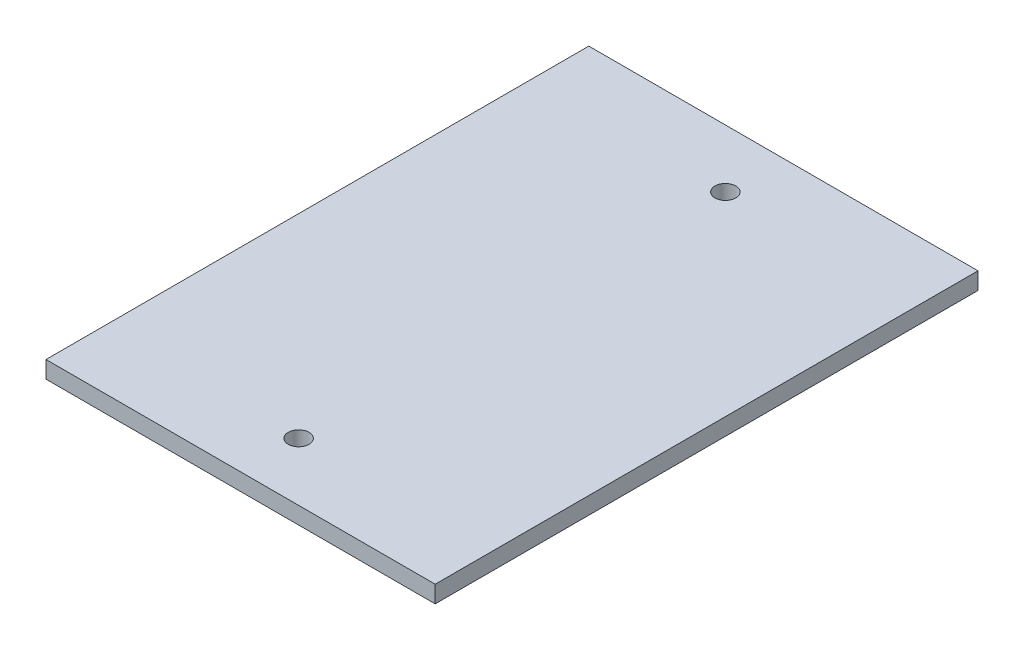
ISO-10303-21;
HEADER;
FILE_DESCRIPTION(('STEP AP214'),'2;1');
FILE_NAME('part.step','',(''),(''),'','','');
FILE_SCHEMA(('AUTOMOTIVE_DESIGN { 1 0 10303 214 1 1 1 1 }'));
ENDSEC;
DATA;
#1=APPLICATION_CONTEXT('core data for automotive mechanical design processes');
#2=APPLICATION_PROTOCOL_DEFINITION('international standard','automotive_design',2000,#1);
#3=PRODUCT_CONTEXT('',#1,'mechanical');
#4=PRODUCT('Part','Part','',(#3));
#5=PRODUCT_RELATED_PRODUCT_CATEGORY('part','',(#4));
#6=PRODUCT_DEFINITION_FORMATION('','',#4);
#7=PRODUCT_DEFINITION_CONTEXT('part definition',#1,'design');
#8=PRODUCT_DEFINITION('design','',#6,#7);
#9=PRODUCT_DEFINITION_SHAPE('','',#8);
#10=(LENGTH_UNIT() NAMED_UNIT(*) SI_UNIT(.MILLI.,.METRE.));
#11=(NAMED_UNIT(*) PLANE_ANGLE_UNIT() SI_UNIT($,.RADIAN.));
#12=(NAMED_UNIT(*) SI_UNIT($,.STERADIAN.) SOLID_ANGLE_UNIT());
#13=UNCERTAINTY_MEASURE_WITH_UNIT(LENGTH_MEASURE(1.E-05),#10,'distance_accuracy_value','');
#14=(GEOMETRIC_REPRESENTATION_CONTEXT(3) GLOBAL_UNCERTAINTY_ASSIGNED_CONTEXT((#13)) GLOBAL_UNIT_ASSIGNED_CONTEXT((#10,
#11,#12)) REPRESENTATION_CONTEXT('',''));
#15=CARTESIAN_POINT('',(0.,0.,0.));
#16=DIRECTION('',(0.,0.,1.));
#17=DIRECTION('',(1.,0.,0.));
#18=AXIS2_PLACEMENT_3D('',#15,#16,#17);
#19=CARTESIAN_POINT('',(28.956,2.54,40.386));
#20=DIRECTION('',(-1.,0.,0.));
#21=DIRECTION('',(0.,0.,1.));
#22=AXIS2_PLACEMENT_3D('',#19,#20,#21);
#23=PLANE('',#22);
#24=DIRECTION('',(0.,0.,-1.));
#25=VECTOR('',#24,1.);
#26=CARTESIAN_POINT('',(28.956,0.,40.386));
#27=LINE('',#26,#25);
#28=CARTESIAN_POINT('',(28.956,0.,40.386));
#29=VERTEX_POINT('',#28);
#30=CARTESIAN_POINT('',(28.956,0.,-40.386));
#31=VERTEX_POINT('',#30);
#32=EDGE_CURVE('E102',#29,#31,#27,.T.);
#33=ORIENTED_EDGE('',*,*,#32,.T.);
#34=DIRECTION('',(0.,-1.,0.));
#35=VECTOR('',#34,1.);
#36=CARTESIAN_POINT('',(28.956,2.54,-40.386));
#37=LINE('',#36,#35);
#38=CARTESIAN_POINT('',(28.956,2.54,-40.386));
#39=VERTEX_POINT('',#38);
#40=EDGE_CURVE('E11',#39,#31,#37,.T.);
#41=ORIENTED_EDGE('',*,*,#40,.F.);
#42=DIRECTION('',(0.,0.,-1.));
#43=VECTOR('',#42,1.);
#44=CARTESIAN_POINT('',(28.956,2.54,40.386));
#45=LINE('',#44,#43);
#46=CARTESIAN_POINT('',(28.956,2.54,40.386));
#47=VERTEX_POINT('',#46);
#48=EDGE_CURVE('E90',#47,#39,#45,.T.);
#49=ORIENTED_EDGE('',*,*,#48,.F.);
#50=DIRECTION('',(0.,-1.,0.));
#51=VECTOR('',#50,1.);
#52=CARTESIAN_POINT('',(28.956,2.54,40.386));
#53=LINE('',#52,#51);
#54=EDGE_CURVE('E98',#47,#29,#53,.T.);
#55=ORIENTED_EDGE('',*,*,#54,.T.);
#56=EDGE_LOOP('',(#33,#41,#49,#55));
#57=FACE_BOUND('',#56,.T.);
#58=ADVANCED_FACE('F39',(#57),#23,.F.);
#59=CARTESIAN_POINT('',(-28.956,2.54,-40.386));
#60=DIRECTION('',(0.,0.,1.));
#61=DIRECTION('',(1.,0.,0.));
#62=AXIS2_PLACEMENT_3D('',#59,#60,#61);
#63=PLANE('',#62);
#64=DIRECTION('',(-1.,0.,0.));
#65=VECTOR('',#64,1.);
#66=CARTESIAN_POINT('',(-28.956,0.,-40.386));
#67=LINE('',#66,#65);
#68=CARTESIAN_POINT('',(-28.956,0.,-40.386));
#69=VERTEX_POINT('',#68);
#70=EDGE_CURVE('E94',#31,#69,#67,.T.);
#71=ORIENTED_EDGE('',*,*,#70,.T.);
#72=DIRECTION('',(0.,-1.,0.));
#73=VECTOR('',#72,1.);
#74=CARTESIAN_POINT('',(-28.956,2.54,-40.386));
#75=LINE('',#74,#73);
#76=CARTESIAN_POINT('',(-28.956,2.54,-40.386));
#77=VERTEX_POINT('',#76);
#78=EDGE_CURVE('E47',#77,#69,#75,.T.);
#79=ORIENTED_EDGE('',*,*,#78,.F.);
#80=DIRECTION('',(-1.,0.,0.));
#81=VECTOR('',#80,1.);
#82=CARTESIAN_POINT('',(-28.956,2.54,-40.386));
#83=LINE('',#82,#81);
#84=EDGE_CURVE('E85',#39,#77,#83,.T.);
#85=ORIENTED_EDGE('',*,*,#84,.F.);
#86=ORIENTED_EDGE('',*,*,#40,.T.);
#87=EDGE_LOOP('',(#71,#79,#85,#86));
#88=FACE_BOUND('',#87,.T.);
#89=ADVANCED_FACE('F93',(#88),#63,.F.);
#90=CARTESIAN_POINT('',(-28.956,2.54,40.386));
#91=DIRECTION('',(1.,0.,0.));
#92=DIRECTION('',(0.,0.,-1.));
#93=AXIS2_PLACEMENT_3D('',#90,#91,#92);
#94=PLANE('',#93);
#95=DIRECTION('',(0.,0.,1.));
#96=VECTOR('',#95,1.);
#97=CARTESIAN_POINT('',(-28.956,0.,40.386));
#98=LINE('',#97,#96);
#99=CARTESIAN_POINT('',(-28.956,0.,40.386));
#100=VERTEX_POINT('',#99);
#101=EDGE_CURVE('E72',#69,#100,#98,.T.);
#102=ORIENTED_EDGE('',*,*,#101,.T.);
#103=DIRECTION('',(0.,-1.,0.));
#104=VECTOR('',#103,1.);
#105=CARTESIAN_POINT('',(-28.956,2.54,40.386));
#106=LINE('',#105,#104);
#107=CARTESIAN_POINT('',(-28.956,2.54,40.386));
#108=VERTEX_POINT('',#107);
#109=EDGE_CURVE('E95',#108,#100,#106,.T.);
#110=ORIENTED_EDGE('',*,*,#109,.F.);
#111=DIRECTION('',(0.,0.,1.));
#112=VECTOR('',#111,1.);
#113=CARTESIAN_POINT('',(-28.956,2.54,40.386));
#114=LINE('',#113,#112);
#115=EDGE_CURVE('E88',#77,#108,#114,.T.);
#116=ORIENTED_EDGE('',*,*,#115,.F.);
#117=ORIENTED_EDGE('',*,*,#78,.T.);
#118=EDGE_LOOP('',(#102,#110,#116,#117));
#119=FACE_BOUND('',#118,.T.);
#120=ADVANCED_FACE('F96',(#119),#94,.F.);
#121=CARTESIAN_POINT('',(-28.956,2.54,40.386));
#122=DIRECTION('',(0.,0.,-1.));
#123=DIRECTION('',(-1.,0.,0.));
#124=AXIS2_PLACEMENT_3D('',#121,#122,#123);
#125=PLANE('',#124);
#126=DIRECTION('',(1.,0.,0.));
#127=VECTOR('',#126,1.);
#128=CARTESIAN_POINT('',(-28.956,0.,40.386));
#129=LINE('',#128,#127);
#130=EDGE_CURVE('E78',#100,#29,#129,.T.);
#131=ORIENTED_EDGE('',*,*,#130,.T.);
#132=ORIENTED_EDGE('',*,*,#54,.F.);
#133=DIRECTION('',(1.,0.,0.));
#134=VECTOR('',#133,1.);
#135=CARTESIAN_POINT('',(-28.956,2.54,40.386));
#136=LINE('',#135,#134);
#137=EDGE_CURVE('E55',#108,#47,#136,.T.);
#138=ORIENTED_EDGE('',*,*,#137,.F.);
#139=ORIENTED_EDGE('',*,*,#109,.T.);
#140=EDGE_LOOP('',(#131,#132,#138,#139));
#141=FACE_BOUND('',#140,.T.);
#142=ADVANCED_FACE('F110',(#141),#125,.F.);
#143=CARTESIAN_POINT('',(0.,2.54,0.));
#144=DIRECTION('',(0.,-1.,0.));
#145=DIRECTION('',(0.,0.,-1.));
#146=AXIS2_PLACEMENT_3D('',#143,#144,#145);
#147=PLANE('',#146);
#148=CARTESIAN_POINT('',(0.,2.54,31.75));
#149=DIRECTION('',(0.,1.,0.));
#150=DIRECTION('',(0.,0.,1.));
#151=AXIS2_PLACEMENT_3D('',#148,#149,#150);
#152=CIRCLE('',#151,1.55);
#153=CARTESIAN_POINT('',(0.,2.54,33.3));
#154=VERTEX_POINT('',#153);
#155=EDGE_CURVE('E122',#154,#154,#152,.T.);
#156=ORIENTED_EDGE('',*,*,#155,.F.);
#157=EDGE_LOOP('',(#156));
#158=FACE_BOUND('',#157,.T.);
#159=CARTESIAN_POINT('',(0.,2.54,-31.75));
#160=DIRECTION('',(0.,1.,0.));
#161=DIRECTION('',(0.,0.,1.));
#162=AXIS2_PLACEMENT_3D('',#159,#160,#161);
#163=CIRCLE('',#162,1.55);
#164=CARTESIAN_POINT('',(0.,2.54,-30.2));
#165=VERTEX_POINT('',#164);
#166=EDGE_CURVE('E119',#165,#165,#163,.T.);
#167=ORIENTED_EDGE('',*,*,#166,.F.);
#168=EDGE_LOOP('',(#167));
#169=FACE_BOUND('',#168,.T.);
#170=ORIENTED_EDGE('',*,*,#48,.T.);
#171=ORIENTED_EDGE('',*,*,#84,.T.);
#172=ORIENTED_EDGE('',*,*,#115,.T.);
#173=ORIENTED_EDGE('',*,*,#137,.T.);
#174=EDGE_LOOP('',(#170,#171,#172,#173));
#175=FACE_BOUND('',#174,.T.);
#176=ADVANCED_FACE('F86',(#158,#169,#175),#147,.F.);
#177=CARTESIAN_POINT('',(0.,0.,0.));
#178=DIRECTION('',(0.,-1.,0.));
#179=DIRECTION('',(0.,0.,-1.));
#180=AXIS2_PLACEMENT_3D('',#177,#178,#179);
#181=PLANE('',#180);
#182=CARTESIAN_POINT('',(0.,0.,31.75));
#183=DIRECTION('',(0.,1.,0.));
#184=DIRECTION('',(0.,0.,1.));
#185=AXIS2_PLACEMENT_3D('',#182,#183,#184);
#186=CIRCLE('',#185,1.55);
#187=CARTESIAN_POINT('',(0.,0.,33.3));
#188=VERTEX_POINT('',#187);
#189=EDGE_CURVE('E105',#188,#188,#186,.T.);
#190=ORIENTED_EDGE('',*,*,#189,.T.);
#191=EDGE_LOOP('',(#190));
#192=FACE_BOUND('',#191,.T.);
#193=CARTESIAN_POINT('',(0.,0.,-31.75));
#194=DIRECTION('',(0.,1.,0.));
#195=DIRECTION('',(0.,0.,1.));
#196=AXIS2_PLACEMENT_3D('',#193,#194,#195);
#197=CIRCLE('',#196,1.55);
#198=CARTESIAN_POINT('',(0.,0.,-30.2));
#199=VERTEX_POINT('',#198);
#200=EDGE_CURVE('E116',#199,#199,#197,.T.);
#201=ORIENTED_EDGE('',*,*,#200,.T.);
#202=EDGE_LOOP('',(#201));
#203=FACE_BOUND('',#202,.T.);
#204=ORIENTED_EDGE('',*,*,#32,.F.);
#205=ORIENTED_EDGE('',*,*,#130,.F.);
#206=ORIENTED_EDGE('',*,*,#101,.F.);
#207=ORIENTED_EDGE('',*,*,#70,.F.);
#208=EDGE_LOOP('',(#204,#205,#206,#207));
#209=FACE_BOUND('',#208,.T.);
#210=ADVANCED_FACE('F113',(#192,#203,#209),#181,.T.);
#211=CARTESIAN_POINT('',(0.,0.,-31.75));
#212=DIRECTION('',(0.,1.,0.));
#213=DIRECTION('',(0.,0.,1.));
#214=AXIS2_PLACEMENT_3D('',#211,#212,#213);
#215=CYLINDRICAL_SURFACE('',#214,1.55);
#216=ORIENTED_EDGE('',*,*,#200,.F.);
#217=EDGE_LOOP('',(#216));
#218=FACE_BOUND('',#217,.T.);
#219=ORIENTED_EDGE('',*,*,#166,.T.);
#220=EDGE_LOOP('',(#219));
#221=FACE_BOUND('',#220,.T.);
#222=ADVANCED_FACE('F133',(#218,#221),#215,.F.);
#223=CARTESIAN_POINT('',(0.,0.,31.75));
#224=DIRECTION('',(0.,1.,0.));
#225=DIRECTION('',(0.,0.,1.));
#226=AXIS2_PLACEMENT_3D('',#223,#224,#225);
#227=CYLINDRICAL_SURFACE('',#226,1.55);
#228=ORIENTED_EDGE('',*,*,#189,.F.);
#229=EDGE_LOOP('',(#228));
#230=FACE_BOUND('',#229,.T.);
#231=ORIENTED_EDGE('',*,*,#155,.T.);
#232=EDGE_LOOP('',(#231));
#233=FACE_BOUND('',#232,.T.);
#234=ADVANCED_FACE('F130',(#230,#233),#227,.F.);
#235=CLOSED_SHELL('',(#58,#89,#120,#142,#176,#210,#222,#234));
#236=MANIFOLD_SOLID_BREP('B2',#235);
#237=ADVANCED_BREP_SHAPE_REPRESENTATION('',(#18,#236),#14);
#238=SHAPE_DEFINITION_REPRESENTATION(#9,#237);
ENDSEC;
END-ISO-10303-21;
